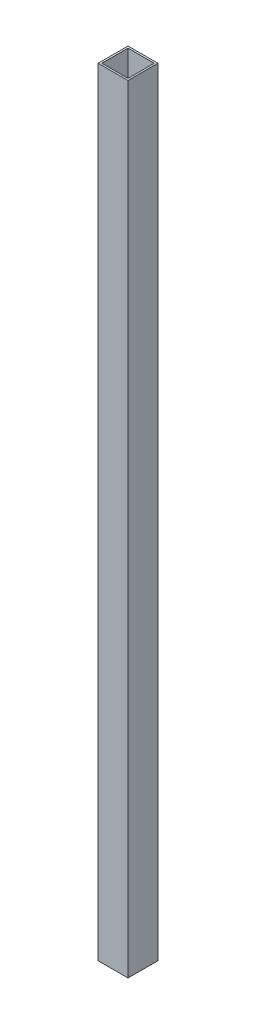
ISO-10303-21;
HEADER;
FILE_DESCRIPTION(('STEP AP214'),'2;1');
FILE_NAME('part.step','',(''),(''),'','','');
FILE_SCHEMA(('AUTOMOTIVE_DESIGN { 1 0 10303 214 1 1 1 1 }'));
ENDSEC;
DATA;
#1=APPLICATION_CONTEXT('core data for automotive mechanical design processes');
#2=APPLICATION_PROTOCOL_DEFINITION('international standard','automotive_design',2000,#1);
#3=PRODUCT_CONTEXT('',#1,'mechanical');
#4=PRODUCT('Part','Part','',(#3));
#5=PRODUCT_RELATED_PRODUCT_CATEGORY('part','',(#4));
#6=PRODUCT_DEFINITION_FORMATION('','',#4);
#7=PRODUCT_DEFINITION_CONTEXT('part definition',#1,'design');
#8=PRODUCT_DEFINITION('design','',#6,#7);
#9=PRODUCT_DEFINITION_SHAPE('','',#8);
#10=(LENGTH_UNIT() NAMED_UNIT(*) SI_UNIT(.MILLI.,.METRE.));
#11=(NAMED_UNIT(*) PLANE_ANGLE_UNIT() SI_UNIT($,.RADIAN.));
#12=(NAMED_UNIT(*) SI_UNIT($,.STERADIAN.) SOLID_ANGLE_UNIT());
#13=UNCERTAINTY_MEASURE_WITH_UNIT(LENGTH_MEASURE(1.E-05),#10,'distance_accuracy_value','');
#14=(GEOMETRIC_REPRESENTATION_CONTEXT(3) GLOBAL_UNCERTAINTY_ASSIGNED_CONTEXT((#13)) GLOBAL_UNIT_ASSIGNED_CONTEXT((#10,
#11,#12)) REPRESENTATION_CONTEXT('',''));
#15=CARTESIAN_POINT('',(0.,0.,0.));
#16=DIRECTION('',(0.,0.,1.));
#17=DIRECTION('',(1.,0.,0.));
#18=AXIS2_PLACEMENT_3D('',#15,#16,#17);
#19=CARTESIAN_POINT('',(0.,660.4,0.));
#20=DIRECTION('',(0.,-1.,0.));
#21=DIRECTION('',(0.,0.,-1.));
#22=AXIS2_PLACEMENT_3D('',#19,#20,#21);
#23=PLANE('',#22);
#24=DIRECTION('',(0.,0.,1.));
#25=VECTOR('',#24,1.);
#26=CARTESIAN_POINT('',(-12.7000000000002,660.400000000001,-12.7));
#27=LINE('',#26,#25);
#28=CARTESIAN_POINT('',(-12.7000000000002,660.400000000001,-12.7));
#29=VERTEX_POINT('',#28);
#30=CARTESIAN_POINT('',(-12.7000000000002,660.400000000001,12.7));
#31=VERTEX_POINT('',#30);
#32=EDGE_CURVE('E131',#29,#31,#27,.T.);
#33=ORIENTED_EDGE('',*,*,#32,.T.);
#34=DIRECTION('',(1.,0.,0.));
#35=VECTOR('',#34,1.);
#36=CARTESIAN_POINT('',(12.6999999999999,660.4,12.6999999999997));
#37=LINE('',#36,#35);
#38=CARTESIAN_POINT('',(12.6999999999999,660.4,12.6999999999997));
#39=VERTEX_POINT('',#38);
#40=EDGE_CURVE('E134',#31,#39,#37,.T.);
#41=ORIENTED_EDGE('',*,*,#40,.T.);
#42=DIRECTION('',(0.,0.,-1.));
#43=VECTOR('',#42,1.);
#44=CARTESIAN_POINT('',(12.6999999999999,660.4,-12.7000000000003));
#45=LINE('',#44,#43);
#46=CARTESIAN_POINT('',(12.6999999999999,660.4,-12.7000000000003));
#47=VERTEX_POINT('',#46);
#48=EDGE_CURVE('E137',#39,#47,#45,.T.);
#49=ORIENTED_EDGE('',*,*,#48,.T.);
#50=DIRECTION('',(-1.,0.,0.));
#51=VECTOR('',#50,1.);
#52=CARTESIAN_POINT('',(12.6999999999999,660.4,-12.7000000000003));
#53=LINE('',#52,#51);
#54=EDGE_CURVE('E139',#47,#29,#53,.T.);
#55=ORIENTED_EDGE('',*,*,#54,.T.);
#56=EDGE_LOOP('',(#33,#41,#49,#55));
#57=FACE_BOUND('',#56,.T.);
#58=DIRECTION('',(0.,0.,1.));
#59=VECTOR('',#58,1.);
#60=CARTESIAN_POINT('',(-11.1125000000001,660.400000000001,-11.1125));
#61=LINE('',#60,#59);
#62=CARTESIAN_POINT('',(-11.1125000000001,660.400000000001,-11.1125));
#63=VERTEX_POINT('',#62);
#64=CARTESIAN_POINT('',(-11.1125000000001,660.400000000001,11.1125));
#65=VERTEX_POINT('',#64);
#66=EDGE_CURVE('E95',#63,#65,#61,.T.);
#67=ORIENTED_EDGE('',*,*,#66,.F.);
#68=DIRECTION('',(-1.,0.,0.));
#69=VECTOR('',#68,1.);
#70=CARTESIAN_POINT('',(11.1124999999996,660.4,-11.1125000000002));
#71=LINE('',#70,#69);
#72=CARTESIAN_POINT('',(11.1124999999996,660.4,-11.1125000000002));
#73=VERTEX_POINT('',#72);
#74=EDGE_CURVE('E117',#73,#63,#71,.T.);
#75=ORIENTED_EDGE('',*,*,#74,.F.);
#76=DIRECTION('',(0.,0.,-1.));
#77=VECTOR('',#76,1.);
#78=CARTESIAN_POINT('',(11.1124999999996,660.4,-11.1125000000002));
#79=LINE('',#78,#77);
#80=CARTESIAN_POINT('',(11.1124999999999,660.4,11.1124999999998));
#81=VERTEX_POINT('',#80);
#82=EDGE_CURVE('E115',#81,#73,#79,.T.);
#83=ORIENTED_EDGE('',*,*,#82,.F.);
#84=DIRECTION('',(1.,0.,0.));
#85=VECTOR('',#84,1.);
#86=CARTESIAN_POINT('',(11.1124999999999,660.4,11.1124999999998));
#87=LINE('',#86,#85);
#88=EDGE_CURVE('E103',#65,#81,#87,.T.);
#89=ORIENTED_EDGE('',*,*,#88,.F.);
#90=EDGE_LOOP('',(#67,#75,#83,#89));
#91=FACE_BOUND('',#90,.T.);
#92=ADVANCED_FACE('F30',(#57,#91),#23,.F.);
#93=CARTESIAN_POINT('',(0.,0.,0.));
#94=DIRECTION('',(0.,-1.,0.));
#95=DIRECTION('',(0.,0.,-1.));
#96=AXIS2_PLACEMENT_3D('',#93,#94,#95);
#97=PLANE('',#96);
#98=DIRECTION('',(0.,0.,1.));
#99=VECTOR('',#98,1.);
#100=CARTESIAN_POINT('',(-12.6999999999999,6.66133814775094E-13,-12.7));
#101=LINE('',#100,#99);
#102=CARTESIAN_POINT('',(-12.6999999999999,6.66133814775094E-13,-12.7));
#103=VERTEX_POINT('',#102);
#104=CARTESIAN_POINT('',(-12.6999999999999,6.66133814775094E-13,12.7));
#105=VERTEX_POINT('',#104);
#106=EDGE_CURVE('E111',#103,#105,#101,.T.);
#107=ORIENTED_EDGE('',*,*,#106,.F.);
#108=DIRECTION('',(-1.,0.,0.));
#109=VECTOR('',#108,1.);
#110=CARTESIAN_POINT('',(12.6999999999999,0.,-12.7000000000003));
#111=LINE('',#110,#109);
#112=CARTESIAN_POINT('',(12.6999999999999,0.,-12.7000000000003));
#113=VERTEX_POINT('',#112);
#114=EDGE_CURVE('E135',#113,#103,#111,.T.);
#115=ORIENTED_EDGE('',*,*,#114,.F.);
#116=DIRECTION('',(0.,0.,-1.));
#117=VECTOR('',#116,1.);
#118=CARTESIAN_POINT('',(12.6999999999999,0.,-12.7000000000003));
#119=LINE('',#118,#117);
#120=CARTESIAN_POINT('',(12.6999999999999,0.,12.6999999999997));
#121=VERTEX_POINT('',#120);
#122=EDGE_CURVE('E146',#121,#113,#119,.T.);
#123=ORIENTED_EDGE('',*,*,#122,.F.);
#124=DIRECTION('',(1.,0.,0.));
#125=VECTOR('',#124,1.);
#126=CARTESIAN_POINT('',(12.6999999999999,0.,12.6999999999997));
#127=LINE('',#126,#125);
#128=EDGE_CURVE('E144',#105,#121,#127,.T.);
#129=ORIENTED_EDGE('',*,*,#128,.F.);
#130=EDGE_LOOP('',(#107,#115,#123,#129));
#131=FACE_BOUND('',#130,.T.);
#132=DIRECTION('',(-1.,0.,0.));
#133=VECTOR('',#132,1.);
#134=CARTESIAN_POINT('',(11.1125000000001,0.,-11.1125000000002));
#135=LINE('',#134,#133);
#136=CARTESIAN_POINT('',(11.1125000000001,0.,-11.1125000000002));
#137=VERTEX_POINT('',#136);
#138=CARTESIAN_POINT('',(-11.1125000000001,6.66133814775094E-13,-11.1125));
#139=VERTEX_POINT('',#138);
#140=EDGE_CURVE('E104',#137,#139,#135,.T.);
#141=ORIENTED_EDGE('',*,*,#140,.T.);
#142=DIRECTION('',(0.,0.,1.));
#143=VECTOR('',#142,1.);
#144=CARTESIAN_POINT('',(-11.1125000000001,6.66133814775094E-13,-11.1125));
#145=LINE('',#144,#143);
#146=CARTESIAN_POINT('',(-11.1125000000001,6.66133814775094E-13,11.1125));
#147=VERTEX_POINT('',#146);
#148=EDGE_CURVE('E53',#139,#147,#145,.T.);
#149=ORIENTED_EDGE('',*,*,#148,.T.);
#150=DIRECTION('',(1.,0.,0.));
#151=VECTOR('',#150,1.);
#152=CARTESIAN_POINT('',(11.1125000000001,0.,11.1124999999998));
#153=LINE('',#152,#151);
#154=CARTESIAN_POINT('',(11.1125000000001,0.,11.1124999999998));
#155=VERTEX_POINT('',#154);
#156=EDGE_CURVE('E110',#147,#155,#153,.T.);
#157=ORIENTED_EDGE('',*,*,#156,.T.);
#158=DIRECTION('',(0.,0.,-1.));
#159=VECTOR('',#158,1.);
#160=CARTESIAN_POINT('',(11.1125000000001,0.,-11.1125000000002));
#161=LINE('',#160,#159);
#162=EDGE_CURVE('E123',#155,#137,#161,.T.);
#163=ORIENTED_EDGE('',*,*,#162,.T.);
#164=EDGE_LOOP('',(#141,#149,#157,#163));
#165=FACE_BOUND('',#164,.T.);
#166=ADVANCED_FACE('F164',(#131,#165),#97,.T.);
#167=CARTESIAN_POINT('',(-12.7000000000002,660.400000000001,-12.7));
#168=DIRECTION('',(1.,0.,0.));
#169=DIRECTION('',(0.,0.,-1.));
#170=AXIS2_PLACEMENT_3D('',#167,#168,#169);
#171=PLANE('',#170);
#172=ORIENTED_EDGE('',*,*,#106,.T.);
#173=DIRECTION('',(0.,-1.,0.));
#174=VECTOR('',#173,1.);
#175=CARTESIAN_POINT('',(-12.7000000000002,660.400000000001,12.7));
#176=LINE('',#175,#174);
#177=EDGE_CURVE('E11',#31,#105,#176,.T.);
#178=ORIENTED_EDGE('',*,*,#177,.F.);
#179=ORIENTED_EDGE('',*,*,#32,.F.);
#180=DIRECTION('',(0.,-1.,0.));
#181=VECTOR('',#180,1.);
#182=CARTESIAN_POINT('',(-12.7000000000002,660.400000000001,-12.7));
#183=LINE('',#182,#181);
#184=EDGE_CURVE('E141',#29,#103,#183,.T.);
#185=ORIENTED_EDGE('',*,*,#184,.T.);
#186=EDGE_LOOP('',(#172,#178,#179,#185));
#187=FACE_BOUND('',#186,.T.);
#188=ADVANCED_FACE('F32',(#187),#171,.F.);
#189=CARTESIAN_POINT('',(12.6999999999999,660.4,12.6999999999997));
#190=DIRECTION('',(0.,0.,-1.));
#191=DIRECTION('',(-1.,0.,0.));
#192=AXIS2_PLACEMENT_3D('',#189,#190,#191);
#193=PLANE('',#192);
#194=ORIENTED_EDGE('',*,*,#128,.T.);
#195=DIRECTION('',(0.,-1.,0.));
#196=VECTOR('',#195,1.);
#197=CARTESIAN_POINT('',(12.6999999999999,660.4,12.6999999999997));
#198=LINE('',#197,#196);
#199=EDGE_CURVE('E38',#39,#121,#198,.T.);
#200=ORIENTED_EDGE('',*,*,#199,.F.);
#201=ORIENTED_EDGE('',*,*,#40,.F.);
#202=ORIENTED_EDGE('',*,*,#177,.T.);
#203=EDGE_LOOP('',(#194,#200,#201,#202));
#204=FACE_BOUND('',#203,.T.);
#205=ADVANCED_FACE('F174',(#204),#193,.F.);
#206=CARTESIAN_POINT('',(12.6999999999999,660.4,-12.7000000000003));
#207=DIRECTION('',(-1.,0.,0.));
#208=DIRECTION('',(0.,0.,1.));
#209=AXIS2_PLACEMENT_3D('',#206,#207,#208);
#210=PLANE('',#209);
#211=ORIENTED_EDGE('',*,*,#122,.T.);
#212=DIRECTION('',(0.,-1.,0.));
#213=VECTOR('',#212,1.);
#214=CARTESIAN_POINT('',(12.6999999999999,660.4,-12.7000000000003));
#215=LINE('',#214,#213);
#216=EDGE_CURVE('E151',#47,#113,#215,.T.);
#217=ORIENTED_EDGE('',*,*,#216,.F.);
#218=ORIENTED_EDGE('',*,*,#48,.F.);
#219=ORIENTED_EDGE('',*,*,#199,.T.);
#220=EDGE_LOOP('',(#211,#217,#218,#219));
#221=FACE_BOUND('',#220,.T.);
#222=ADVANCED_FACE('F158',(#221),#210,.F.);
#223=CARTESIAN_POINT('',(12.6999999999999,660.4,-12.7000000000003));
#224=DIRECTION('',(0.,0.,1.));
#225=DIRECTION('',(1.,0.,0.));
#226=AXIS2_PLACEMENT_3D('',#223,#224,#225);
#227=PLANE('',#226);
#228=ORIENTED_EDGE('',*,*,#114,.T.);
#229=ORIENTED_EDGE('',*,*,#184,.F.);
#230=ORIENTED_EDGE('',*,*,#54,.F.);
#231=ORIENTED_EDGE('',*,*,#216,.T.);
#232=EDGE_LOOP('',(#228,#229,#230,#231));
#233=FACE_BOUND('',#232,.T.);
#234=ADVANCED_FACE('F168',(#233),#227,.F.);
#235=CARTESIAN_POINT('',(-11.1125000000001,660.400000000001,-11.1125));
#236=DIRECTION('',(1.,0.,0.));
#237=DIRECTION('',(0.,0.,-1.));
#238=AXIS2_PLACEMENT_3D('',#235,#236,#237);
#239=PLANE('',#238);
#240=ORIENTED_EDGE('',*,*,#148,.F.);
#241=DIRECTION('',(0.,-1.,0.));
#242=VECTOR('',#241,1.);
#243=CARTESIAN_POINT('',(-11.1125000000001,660.400000000001,-11.1125));
#244=LINE('',#243,#242);
#245=EDGE_CURVE('E99',#63,#139,#244,.T.);
#246=ORIENTED_EDGE('',*,*,#245,.F.);
#247=ORIENTED_EDGE('',*,*,#66,.T.);
#248=DIRECTION('',(0.,-1.,0.));
#249=VECTOR('',#248,1.);
#250=CARTESIAN_POINT('',(-11.1125000000001,660.400000000001,11.1125));
#251=LINE('',#250,#249);
#252=EDGE_CURVE('E98',#65,#147,#251,.T.);
#253=ORIENTED_EDGE('',*,*,#252,.T.);
#254=EDGE_LOOP('',(#240,#246,#247,#253));
#255=FACE_BOUND('',#254,.T.);
#256=ADVANCED_FACE('F97',(#255),#239,.T.);
#257=CARTESIAN_POINT('',(11.1124999999999,660.4,11.1124999999998));
#258=DIRECTION('',(0.,0.,-1.));
#259=DIRECTION('',(-1.,0.,0.));
#260=AXIS2_PLACEMENT_3D('',#257,#258,#259);
#261=PLANE('',#260);
#262=ORIENTED_EDGE('',*,*,#156,.F.);
#263=ORIENTED_EDGE('',*,*,#252,.F.);
#264=ORIENTED_EDGE('',*,*,#88,.T.);
#265=DIRECTION('',(0.,-1.,0.));
#266=VECTOR('',#265,1.);
#267=CARTESIAN_POINT('',(11.1124999999999,660.4,11.1124999999998));
#268=LINE('',#267,#266);
#269=EDGE_CURVE('E112',#81,#155,#268,.T.);
#270=ORIENTED_EDGE('',*,*,#269,.T.);
#271=EDGE_LOOP('',(#262,#263,#264,#270));
#272=FACE_BOUND('',#271,.T.);
#273=ADVANCED_FACE('F107',(#272),#261,.T.);
#274=CARTESIAN_POINT('',(11.1124999999996,660.4,-11.1125000000002));
#275=DIRECTION('',(-1.,0.,0.));
#276=DIRECTION('',(0.,0.,1.));
#277=AXIS2_PLACEMENT_3D('',#274,#275,#276);
#278=PLANE('',#277);
#279=ORIENTED_EDGE('',*,*,#162,.F.);
#280=ORIENTED_EDGE('',*,*,#269,.F.);
#281=ORIENTED_EDGE('',*,*,#82,.T.);
#282=DIRECTION('',(0.,-1.,0.));
#283=VECTOR('',#282,1.);
#284=CARTESIAN_POINT('',(11.1124999999996,660.4,-11.1125000000002));
#285=LINE('',#284,#283);
#286=EDGE_CURVE('E45',#73,#137,#285,.T.);
#287=ORIENTED_EDGE('',*,*,#286,.T.);
#288=EDGE_LOOP('',(#279,#280,#281,#287));
#289=FACE_BOUND('',#288,.T.);
#290=ADVANCED_FACE('F197',(#289),#278,.T.);
#291=CARTESIAN_POINT('',(11.1124999999996,660.4,-11.1125000000002));
#292=DIRECTION('',(0.,0.,1.));
#293=DIRECTION('',(1.,0.,0.));
#294=AXIS2_PLACEMENT_3D('',#291,#292,#293);
#295=PLANE('',#294);
#296=ORIENTED_EDGE('',*,*,#140,.F.);
#297=ORIENTED_EDGE('',*,*,#286,.F.);
#298=ORIENTED_EDGE('',*,*,#74,.T.);
#299=ORIENTED_EDGE('',*,*,#245,.T.);
#300=EDGE_LOOP('',(#296,#297,#298,#299));
#301=FACE_BOUND('',#300,.T.);
#302=ADVANCED_FACE('F201',(#301),#295,.T.);
#303=CLOSED_SHELL('',(#92,#166,#188,#205,#222,#234,#256,#273,#290,#302));
#304=MANIFOLD_SOLID_BREP('B2',#303);
#305=ADVANCED_BREP_SHAPE_REPRESENTATION('',(#18,#304),#14);
#306=SHAPE_DEFINITION_REPRESENTATION(#9,#305);
ENDSEC;
END-ISO-10303-21;
